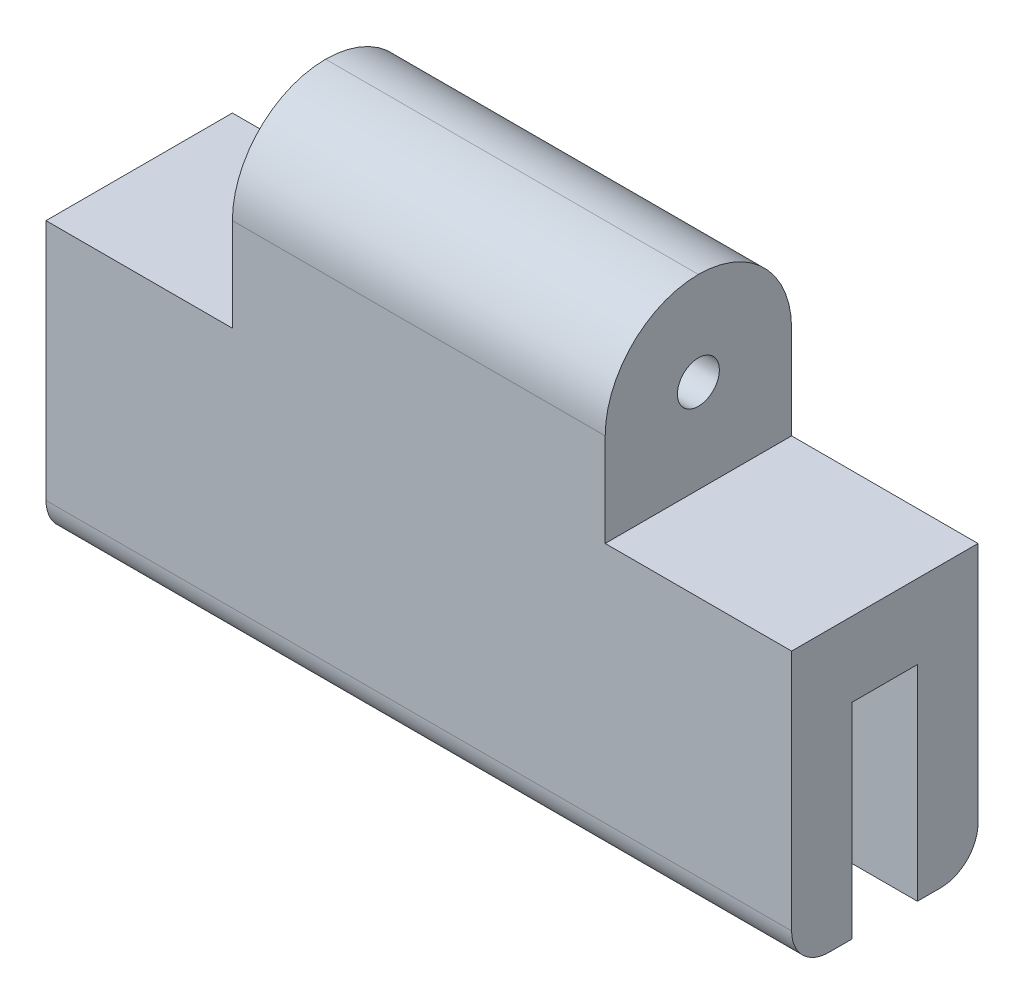
ISO-10303-21;
HEADER;
FILE_DESCRIPTION(('STEP AP214'),'2;1');
FILE_NAME('part.step','',(''),(''),'','','');
FILE_SCHEMA(('AUTOMOTIVE_DESIGN { 1 0 10303 214 1 1 1 1 }'));
ENDSEC;
DATA;
#1=APPLICATION_CONTEXT('core data for automotive mechanical design processes');
#2=APPLICATION_PROTOCOL_DEFINITION('international standard','automotive_design',2000,#1);
#3=PRODUCT_CONTEXT('',#1,'mechanical');
#4=PRODUCT('Part','Part','',(#3));
#5=PRODUCT_RELATED_PRODUCT_CATEGORY('part','',(#4));
#6=PRODUCT_DEFINITION_FORMATION('','',#4);
#7=PRODUCT_DEFINITION_CONTEXT('part definition',#1,'design');
#8=PRODUCT_DEFINITION('design','',#6,#7);
#9=PRODUCT_DEFINITION_SHAPE('','',#8);
#10=(LENGTH_UNIT() NAMED_UNIT(*) SI_UNIT(.MILLI.,.METRE.));
#11=(NAMED_UNIT(*) PLANE_ANGLE_UNIT() SI_UNIT($,.RADIAN.));
#12=(NAMED_UNIT(*) SI_UNIT($,.STERADIAN.) SOLID_ANGLE_UNIT());
#13=UNCERTAINTY_MEASURE_WITH_UNIT(LENGTH_MEASURE(1.E-05),#10,'distance_accuracy_value','');
#14=(GEOMETRIC_REPRESENTATION_CONTEXT(3) GLOBAL_UNCERTAINTY_ASSIGNED_CONTEXT((#13)) GLOBAL_UNIT_ASSIGNED_CONTEXT((#10,
#11,#12)) REPRESENTATION_CONTEXT('',''));
#15=CARTESIAN_POINT('',(0.,0.,0.));
#16=DIRECTION('',(0.,0.,1.));
#17=DIRECTION('',(1.,0.,0.));
#18=AXIS2_PLACEMENT_3D('',#15,#16,#17);
#19=CARTESIAN_POINT('',(0.,30.,0.));
#20=DIRECTION('',(0.,1.,0.));
#21=DIRECTION('',(0.,0.,1.));
#22=AXIS2_PLACEMENT_3D('',#19,#20,#21);
#23=PLANE('',#22);
#24=DIRECTION('',(0.,0.,1.));
#25=VECTOR('',#24,1.);
#26=CARTESIAN_POINT('',(20.,30.,0.));
#27=LINE('',#26,#25);
#28=CARTESIAN_POINT('',(20.,30.,0.));
#29=VERTEX_POINT('',#28);
#30=CARTESIAN_POINT('',(20.,30.,20.));
#31=VERTEX_POINT('',#30);
#32=EDGE_CURVE('E166',#29,#31,#27,.T.);
#33=ORIENTED_EDGE('',*,*,#32,.F.);
#34=DIRECTION('',(-1.,0.,0.));
#35=VECTOR('',#34,1.);
#36=CARTESIAN_POINT('',(0.,30.,0.));
#37=LINE('',#36,#35);
#38=CARTESIAN_POINT('',(0.,30.,0.));
#39=VERTEX_POINT('',#38);
#40=EDGE_CURVE('E162',#29,#39,#37,.T.);
#41=ORIENTED_EDGE('',*,*,#40,.T.);
#42=DIRECTION('',(0.,0.,1.));
#43=VECTOR('',#42,1.);
#44=CARTESIAN_POINT('',(0.,30.,0.));
#45=LINE('',#44,#43);
#46=CARTESIAN_POINT('',(0.,30.,20.));
#47=VERTEX_POINT('',#46);
#48=EDGE_CURVE('E205',#39,#47,#45,.T.);
#49=ORIENTED_EDGE('',*,*,#48,.T.);
#50=DIRECTION('',(1.,0.,0.));
#51=VECTOR('',#50,1.);
#52=CARTESIAN_POINT('',(0.,30.,20.));
#53=LINE('',#52,#51);
#54=EDGE_CURVE('E210',#47,#31,#53,.T.);
#55=ORIENTED_EDGE('',*,*,#54,.T.);
#56=EDGE_LOOP('',(#33,#41,#49,#55));
#57=FACE_BOUND('',#56,.T.);
#58=ADVANCED_FACE('F33',(#57),#23,.T.);
#59=CARTESIAN_POINT('',(0.,0.,0.));
#60=DIRECTION('',(0.,1.,0.));
#61=DIRECTION('',(0.,0.,1.));
#62=AXIS2_PLACEMENT_3D('',#59,#60,#61);
#63=PLANE('',#62);
#64=DIRECTION('',(0.,0.,-1.));
#65=VECTOR('',#64,1.);
#66=CARTESIAN_POINT('',(80.,0.,0.));
#67=LINE('',#66,#65);
#68=CARTESIAN_POINT('',(80.,0.,16.));
#69=VERTEX_POINT('',#68);
#70=CARTESIAN_POINT('',(80.,0.,13.5));
#71=VERTEX_POINT('',#70);
#72=EDGE_CURVE('E209',#69,#71,#67,.T.);
#73=ORIENTED_EDGE('',*,*,#72,.F.);
#74=DIRECTION('',(1.,0.,0.));
#75=VECTOR('',#74,1.);
#76=CARTESIAN_POINT('',(0.,0.,16.));
#77=LINE('',#76,#75);
#78=CARTESIAN_POINT('',(0.,0.,16.));
#79=VERTEX_POINT('',#78);
#80=EDGE_CURVE('E11',#69,#79,#77,.F.);
#81=ORIENTED_EDGE('',*,*,#80,.T.);
#82=DIRECTION('',(0.,0.,1.));
#83=VECTOR('',#82,1.);
#84=CARTESIAN_POINT('',(0.,0.,0.));
#85=LINE('',#84,#83);
#86=CARTESIAN_POINT('',(0.,0.,13.5));
#87=VERTEX_POINT('',#86);
#88=EDGE_CURVE('E196',#87,#79,#85,.T.);
#89=ORIENTED_EDGE('',*,*,#88,.F.);
#90=DIRECTION('',(-1.,0.,0.));
#91=VECTOR('',#90,1.);
#92=CARTESIAN_POINT('',(0.,0.,13.5));
#93=LINE('',#92,#91);
#94=EDGE_CURVE('E182',#71,#87,#93,.T.);
#95=ORIENTED_EDGE('',*,*,#94,.F.);
#96=EDGE_LOOP('',(#73,#81,#89,#95));
#97=FACE_BOUND('',#96,.T.);
#98=ADVANCED_FACE('F291',(#97),#63,.F.);
#99=CARTESIAN_POINT('',(0.,30.,0.));
#100=DIRECTION('',(1.,0.,0.));
#101=DIRECTION('',(0.,0.,-1.));
#102=AXIS2_PLACEMENT_3D('',#99,#100,#101);
#103=PLANE('',#102);
#104=DIRECTION('',(0.,-1.,0.));
#105=VECTOR('',#104,1.);
#106=CARTESIAN_POINT('',(0.,30.,0.));
#107=LINE('',#106,#105);
#108=CARTESIAN_POINT('',(0.,4.,0.));
#109=VERTEX_POINT('',#108);
#110=EDGE_CURVE('E161',#39,#109,#107,.T.);
#111=ORIENTED_EDGE('',*,*,#110,.T.);
#112=CARTESIAN_POINT('',(0.,4.,4.));
#113=DIRECTION('',(1.,0.,0.));
#114=DIRECTION('',(0.,0.,-1.));
#115=AXIS2_PLACEMENT_3D('',#112,#113,#114);
#116=CIRCLE('',#115,4.);
#117=CARTESIAN_POINT('',(0.,0.,4.));
#118=VERTEX_POINT('',#117);
#119=EDGE_CURVE('E249',#109,#118,#116,.F.);
#120=ORIENTED_EDGE('',*,*,#119,.T.);
#121=CARTESIAN_POINT('',(0.,0.,6.5));
#122=VERTEX_POINT('',#121);
#123=EDGE_CURVE('E214',#118,#122,#85,.T.);
#124=ORIENTED_EDGE('',*,*,#123,.T.);
#125=DIRECTION('',(0.,-1.,0.));
#126=VECTOR('',#125,1.);
#127=CARTESIAN_POINT('',(0.,22.,6.49999999999999));
#128=LINE('',#127,#126);
#129=CARTESIAN_POINT('',(0.,22.,6.49999999999999));
#130=VERTEX_POINT('',#129);
#131=EDGE_CURVE('E190',#130,#122,#128,.T.);
#132=ORIENTED_EDGE('',*,*,#131,.F.);
#133=DIRECTION('',(0.,0.,-1.));
#134=VECTOR('',#133,1.);
#135=CARTESIAN_POINT('',(0.,22.,6.49999999999999));
#136=LINE('',#135,#134);
#137=CARTESIAN_POINT('',(0.,22.,13.5));
#138=VERTEX_POINT('',#137);
#139=EDGE_CURVE('E178',#138,#130,#136,.T.);
#140=ORIENTED_EDGE('',*,*,#139,.F.);
#141=DIRECTION('',(0.,-1.,0.));
#142=VECTOR('',#141,1.);
#143=CARTESIAN_POINT('',(0.,22.,13.5));
#144=LINE('',#143,#142);
#145=EDGE_CURVE('E193',#138,#87,#144,.T.);
#146=ORIENTED_EDGE('',*,*,#145,.T.);
#147=ORIENTED_EDGE('',*,*,#88,.T.);
#148=CARTESIAN_POINT('',(0.,4.,16.));
#149=DIRECTION('',(1.,0.,0.));
#150=DIRECTION('',(0.,0.,-1.));
#151=AXIS2_PLACEMENT_3D('',#148,#149,#150);
#152=CIRCLE('',#151,4.);
#153=CARTESIAN_POINT('',(0.,4.,20.));
#154=VERTEX_POINT('',#153);
#155=EDGE_CURVE('E247',#79,#154,#152,.F.);
#156=ORIENTED_EDGE('',*,*,#155,.T.);
#157=DIRECTION('',(0.,-1.,0.));
#158=VECTOR('',#157,1.);
#159=CARTESIAN_POINT('',(0.,30.,20.));
#160=LINE('',#159,#158);
#161=EDGE_CURVE('E224',#47,#154,#160,.T.);
#162=ORIENTED_EDGE('',*,*,#161,.F.);
#163=ORIENTED_EDGE('',*,*,#48,.F.);
#164=EDGE_LOOP('',(#111,#120,#124,#132,#140,#146,#147,#156,#162,#163));
#165=FACE_BOUND('',#164,.T.);
#166=ADVANCED_FACE('F270',(#165),#103,.F.);
#167=CARTESIAN_POINT('',(0.,30.,20.));
#168=DIRECTION('',(0.,0.,-1.));
#169=DIRECTION('',(-1.,0.,0.));
#170=AXIS2_PLACEMENT_3D('',#167,#168,#169);
#171=PLANE('',#170);
#172=ORIENTED_EDGE('',*,*,#161,.T.);
#173=DIRECTION('',(1.,0.,0.));
#174=VECTOR('',#173,1.);
#175=CARTESIAN_POINT('',(0.,4.,20.));
#176=LINE('',#175,#174);
#177=CARTESIAN_POINT('',(80.,4.,20.));
#178=VERTEX_POINT('',#177);
#179=EDGE_CURVE('E41',#154,#178,#176,.T.);
#180=ORIENTED_EDGE('',*,*,#179,.T.);
#181=DIRECTION('',(0.,-1.,0.));
#182=VECTOR('',#181,1.);
#183=CARTESIAN_POINT('',(80.,30.,20.));
#184=LINE('',#183,#182);
#185=CARTESIAN_POINT('',(80.,30.,20.));
#186=VERTEX_POINT('',#185);
#187=EDGE_CURVE('E222',#186,#178,#184,.T.);
#188=ORIENTED_EDGE('',*,*,#187,.F.);
#189=CARTESIAN_POINT('',(60.,30.,20.));
#190=VERTEX_POINT('',#189);
#191=EDGE_CURVE('E208',#190,#186,#53,.T.);
#192=ORIENTED_EDGE('',*,*,#191,.F.);
#193=DIRECTION('',(0.,-1.,0.));
#194=VECTOR('',#193,1.);
#195=CARTESIAN_POINT('',(60.,50.,20.));
#196=LINE('',#195,#194);
#197=CARTESIAN_POINT('',(60.,40.,20.));
#198=VERTEX_POINT('',#197);
#199=EDGE_CURVE('E150',#198,#190,#196,.T.);
#200=ORIENTED_EDGE('',*,*,#199,.F.);
#201=DIRECTION('',(1.,0.,0.));
#202=VECTOR('',#201,1.);
#203=CARTESIAN_POINT('',(20.,40.,20.));
#204=LINE('',#203,#202);
#205=CARTESIAN_POINT('',(20.,40.,20.));
#206=VERTEX_POINT('',#205);
#207=EDGE_CURVE('E239',#198,#206,#204,.F.);
#208=ORIENTED_EDGE('',*,*,#207,.T.);
#209=DIRECTION('',(0.,-1.,0.));
#210=VECTOR('',#209,1.);
#211=CARTESIAN_POINT('',(20.,50.,20.));
#212=LINE('',#211,#210);
#213=EDGE_CURVE('E175',#206,#31,#212,.T.);
#214=ORIENTED_EDGE('',*,*,#213,.T.);
#215=ORIENTED_EDGE('',*,*,#54,.F.);
#216=EDGE_LOOP('',(#172,#180,#188,#192,#200,#208,#214,#215));
#217=FACE_BOUND('',#216,.T.);
#218=ADVANCED_FACE('F257',(#217),#171,.F.);
#219=CARTESIAN_POINT('',(80.,30.,0.));
#220=DIRECTION('',(-1.,0.,0.));
#221=DIRECTION('',(0.,0.,1.));
#222=AXIS2_PLACEMENT_3D('',#219,#220,#221);
#223=PLANE('',#222);
#224=CARTESIAN_POINT('',(80.,0.,6.5));
#225=VERTEX_POINT('',#224);
#226=CARTESIAN_POINT('',(80.,0.,4.));
#227=VERTEX_POINT('',#226);
#228=EDGE_CURVE('E216',#225,#227,#67,.T.);
#229=ORIENTED_EDGE('',*,*,#228,.T.);
#230=CARTESIAN_POINT('',(80.,4.,4.));
#231=DIRECTION('',(-1.,0.,0.));
#232=DIRECTION('',(0.,0.,1.));
#233=AXIS2_PLACEMENT_3D('',#230,#231,#232);
#234=CIRCLE('',#233,4.);
#235=CARTESIAN_POINT('',(80.,4.,0.));
#236=VERTEX_POINT('',#235);
#237=EDGE_CURVE('E254',#227,#236,#234,.F.);
#238=ORIENTED_EDGE('',*,*,#237,.T.);
#239=DIRECTION('',(0.,-1.,0.));
#240=VECTOR('',#239,1.);
#241=CARTESIAN_POINT('',(80.,30.,0.));
#242=LINE('',#241,#240);
#243=CARTESIAN_POINT('',(80.,30.,0.));
#244=VERTEX_POINT('',#243);
#245=EDGE_CURVE('E220',#244,#236,#242,.T.);
#246=ORIENTED_EDGE('',*,*,#245,.F.);
#247=DIRECTION('',(0.,0.,-1.));
#248=VECTOR('',#247,1.);
#249=CARTESIAN_POINT('',(80.,30.,0.));
#250=LINE('',#249,#248);
#251=EDGE_CURVE('E159',#186,#244,#250,.T.);
#252=ORIENTED_EDGE('',*,*,#251,.F.);
#253=ORIENTED_EDGE('',*,*,#187,.T.);
#254=CARTESIAN_POINT('',(80.,4.,16.));
#255=DIRECTION('',(-1.,0.,0.));
#256=DIRECTION('',(0.,0.,1.));
#257=AXIS2_PLACEMENT_3D('',#254,#255,#256);
#258=CIRCLE('',#257,4.);
#259=EDGE_CURVE('E48',#178,#69,#258,.F.);
#260=ORIENTED_EDGE('',*,*,#259,.T.);
#261=ORIENTED_EDGE('',*,*,#72,.T.);
#262=DIRECTION('',(0.,-1.,0.));
#263=VECTOR('',#262,1.);
#264=CARTESIAN_POINT('',(80.,22.,13.5));
#265=LINE('',#264,#263);
#266=CARTESIAN_POINT('',(80.,22.,13.5));
#267=VERTEX_POINT('',#266);
#268=EDGE_CURVE('E197',#267,#71,#265,.T.);
#269=ORIENTED_EDGE('',*,*,#268,.F.);
#270=DIRECTION('',(0.,0.,1.));
#271=VECTOR('',#270,1.);
#272=CARTESIAN_POINT('',(80.,22.,6.5));
#273=LINE('',#272,#271);
#274=CARTESIAN_POINT('',(80.,22.,6.5));
#275=VERTEX_POINT('',#274);
#276=EDGE_CURVE('E185',#275,#267,#273,.T.);
#277=ORIENTED_EDGE('',*,*,#276,.F.);
#278=DIRECTION('',(0.,-1.,0.));
#279=VECTOR('',#278,1.);
#280=CARTESIAN_POINT('',(80.,22.,6.5));
#281=LINE('',#280,#279);
#282=EDGE_CURVE('E200',#275,#225,#281,.T.);
#283=ORIENTED_EDGE('',*,*,#282,.T.);
#284=EDGE_LOOP('',(#229,#238,#246,#252,#253,#260,#261,#269,#277,#283));
#285=FACE_BOUND('',#284,.T.);
#286=ADVANCED_FACE('F261',(#285),#223,.F.);
#287=CARTESIAN_POINT('',(0.,30.,0.));
#288=DIRECTION('',(0.,0.,1.));
#289=DIRECTION('',(1.,0.,0.));
#290=AXIS2_PLACEMENT_3D('',#287,#288,#289);
#291=PLANE('',#290);
#292=ORIENTED_EDGE('',*,*,#245,.T.);
#293=DIRECTION('',(-1.,0.,0.));
#294=VECTOR('',#293,1.);
#295=CARTESIAN_POINT('',(0.,4.,0.));
#296=LINE('',#295,#294);
#297=EDGE_CURVE('E241',#236,#109,#296,.T.);
#298=ORIENTED_EDGE('',*,*,#297,.T.);
#299=ORIENTED_EDGE('',*,*,#110,.F.);
#300=ORIENTED_EDGE('',*,*,#40,.F.);
#301=DIRECTION('',(0.,-1.,0.));
#302=VECTOR('',#301,1.);
#303=CARTESIAN_POINT('',(20.,50.,0.));
#304=LINE('',#303,#302);
#305=CARTESIAN_POINT('',(20.,40.,0.));
#306=VERTEX_POINT('',#305);
#307=EDGE_CURVE('E151',#306,#29,#304,.T.);
#308=ORIENTED_EDGE('',*,*,#307,.F.);
#309=DIRECTION('',(-1.,0.,0.));
#310=VECTOR('',#309,1.);
#311=CARTESIAN_POINT('',(60.,40.,0.));
#312=LINE('',#311,#310);
#313=CARTESIAN_POINT('',(60.,40.,0.));
#314=VERTEX_POINT('',#313);
#315=EDGE_CURVE('E147',#306,#314,#312,.F.);
#316=ORIENTED_EDGE('',*,*,#315,.T.);
#317=DIRECTION('',(0.,-1.,0.));
#318=VECTOR('',#317,1.);
#319=CARTESIAN_POINT('',(60.,50.,0.));
#320=LINE('',#319,#318);
#321=CARTESIAN_POINT('',(60.,30.,0.));
#322=VERTEX_POINT('',#321);
#323=EDGE_CURVE('E140',#314,#322,#320,.T.);
#324=ORIENTED_EDGE('',*,*,#323,.T.);
#325=EDGE_CURVE('E144',#244,#322,#37,.T.);
#326=ORIENTED_EDGE('',*,*,#325,.F.);
#327=EDGE_LOOP('',(#292,#298,#299,#300,#308,#316,#324,#326));
#328=FACE_BOUND('',#327,.T.);
#329=ADVANCED_FACE('F143',(#328),#291,.F.);
#330=DIRECTION('',(0.,0.,-1.));
#331=VECTOR('',#330,1.);
#332=CARTESIAN_POINT('',(60.,30.,0.));
#333=LINE('',#332,#331);
#334=EDGE_CURVE('E156',#190,#322,#333,.T.);
#335=ORIENTED_EDGE('',*,*,#334,.F.);
#336=ORIENTED_EDGE('',*,*,#191,.T.);
#337=ORIENTED_EDGE('',*,*,#251,.T.);
#338=ORIENTED_EDGE('',*,*,#325,.T.);
#339=EDGE_LOOP('',(#335,#336,#337,#338));
#340=FACE_BOUND('',#339,.T.);
#341=ADVANCED_FACE('F155',(#340),#23,.T.);
#342=ORIENTED_EDGE('',*,*,#123,.F.);
#343=DIRECTION('',(-1.,0.,0.));
#344=VECTOR('',#343,1.);
#345=CARTESIAN_POINT('',(0.,0.,4.));
#346=LINE('',#345,#344);
#347=EDGE_CURVE('E251',#118,#227,#346,.F.);
#348=ORIENTED_EDGE('',*,*,#347,.T.);
#349=ORIENTED_EDGE('',*,*,#228,.F.);
#350=DIRECTION('',(1.,0.,0.));
#351=VECTOR('',#350,1.);
#352=CARTESIAN_POINT('',(0.,0.,6.49999999999999));
#353=LINE('',#352,#351);
#354=EDGE_CURVE('E177',#122,#225,#353,.T.);
#355=ORIENTED_EDGE('',*,*,#354,.F.);
#356=EDGE_LOOP('',(#342,#348,#349,#355));
#357=FACE_BOUND('',#356,.T.);
#358=ADVANCED_FACE('F275',(#357),#63,.F.);
#359=CARTESIAN_POINT('',(0.,22.,13.5));
#360=DIRECTION('',(0.,0.,1.));
#361=DIRECTION('',(1.,0.,0.));
#362=AXIS2_PLACEMENT_3D('',#359,#360,#361);
#363=PLANE('',#362);
#364=ORIENTED_EDGE('',*,*,#94,.T.);
#365=ORIENTED_EDGE('',*,*,#145,.F.);
#366=DIRECTION('',(-1.,0.,0.));
#367=VECTOR('',#366,1.);
#368=CARTESIAN_POINT('',(0.,22.,13.5));
#369=LINE('',#368,#367);
#370=EDGE_CURVE('E187',#267,#138,#369,.T.);
#371=ORIENTED_EDGE('',*,*,#370,.F.);
#372=ORIENTED_EDGE('',*,*,#268,.T.);
#373=EDGE_LOOP('',(#364,#365,#371,#372));
#374=FACE_BOUND('',#373,.T.);
#375=ADVANCED_FACE('F286',(#374),#363,.F.);
#376=CARTESIAN_POINT('',(0.,22.,6.49999999999999));
#377=DIRECTION('',(0.,0.,-1.));
#378=DIRECTION('',(-1.,0.,0.));
#379=AXIS2_PLACEMENT_3D('',#376,#377,#378);
#380=PLANE('',#379);
#381=ORIENTED_EDGE('',*,*,#354,.T.);
#382=ORIENTED_EDGE('',*,*,#282,.F.);
#383=DIRECTION('',(1.,0.,0.));
#384=VECTOR('',#383,1.);
#385=CARTESIAN_POINT('',(0.,22.,6.49999999999999));
#386=LINE('',#385,#384);
#387=EDGE_CURVE('E181',#130,#275,#386,.T.);
#388=ORIENTED_EDGE('',*,*,#387,.F.);
#389=ORIENTED_EDGE('',*,*,#131,.T.);
#390=EDGE_LOOP('',(#381,#382,#388,#389));
#391=FACE_BOUND('',#390,.T.);
#392=ADVANCED_FACE('F278',(#391),#380,.F.);
#393=CARTESIAN_POINT('',(0.,22.,0.));
#394=DIRECTION('',(0.,1.,0.));
#395=DIRECTION('',(0.,0.,1.));
#396=AXIS2_PLACEMENT_3D('',#393,#394,#395);
#397=PLANE('',#396);
#398=ORIENTED_EDGE('',*,*,#139,.T.);
#399=ORIENTED_EDGE('',*,*,#387,.T.);
#400=ORIENTED_EDGE('',*,*,#276,.T.);
#401=ORIENTED_EDGE('',*,*,#370,.T.);
#402=EDGE_LOOP('',(#398,#399,#400,#401));
#403=FACE_BOUND('',#402,.T.);
#404=ADVANCED_FACE('F283',(#403),#397,.F.);
#405=CARTESIAN_POINT('',(20.,50.,0.));
#406=DIRECTION('',(1.,0.,0.));
#407=DIRECTION('',(0.,0.,-1.));
#408=AXIS2_PLACEMENT_3D('',#405,#406,#407);
#409=PLANE('',#408);
#410=CARTESIAN_POINT('',(20.,40.,10.));
#411=DIRECTION('',(-1.,0.,0.));
#412=DIRECTION('',(0.,0.,1.));
#413=AXIS2_PLACEMENT_3D('',#410,#411,#412);
#414=CIRCLE('',#413,2.25);
#415=CARTESIAN_POINT('',(20.,40.,12.25));
#416=VERTEX_POINT('',#415);
#417=EDGE_CURVE('E230',#416,#416,#414,.T.);
#418=ORIENTED_EDGE('',*,*,#417,.F.);
#419=EDGE_LOOP('',(#418));
#420=FACE_BOUND('',#419,.T.);
#421=CARTESIAN_POINT('',(20.,40.,10.));
#422=DIRECTION('',(1.,0.,0.));
#423=DIRECTION('',(0.,0.,-1.));
#424=AXIS2_PLACEMENT_3D('',#421,#422,#423);
#425=CIRCLE('',#424,10.);
#426=CARTESIAN_POINT('',(20.,50.,10.));
#427=VERTEX_POINT('',#426);
#428=EDGE_CURVE('E227',#206,#427,#425,.F.);
#429=ORIENTED_EDGE('',*,*,#428,.T.);
#430=CARTESIAN_POINT('',(20.,40.,10.));
#431=DIRECTION('',(1.,0.,0.));
#432=DIRECTION('',(0.,0.,-1.));
#433=AXIS2_PLACEMENT_3D('',#430,#431,#432);
#434=CIRCLE('',#433,10.);
#435=EDGE_CURVE('E232',#427,#306,#434,.F.);
#436=ORIENTED_EDGE('',*,*,#435,.T.);
#437=ORIENTED_EDGE('',*,*,#307,.T.);
#438=ORIENTED_EDGE('',*,*,#32,.T.);
#439=ORIENTED_EDGE('',*,*,#213,.F.);
#440=EDGE_LOOP('',(#429,#436,#437,#438,#439));
#441=FACE_BOUND('',#440,.T.);
#442=ADVANCED_FACE('F306',(#420,#441),#409,.F.);
#443=CARTESIAN_POINT('',(60.,50.,0.));
#444=DIRECTION('',(-1.,0.,0.));
#445=DIRECTION('',(0.,0.,1.));
#446=AXIS2_PLACEMENT_3D('',#443,#444,#445);
#447=PLANE('',#446);
#448=CARTESIAN_POINT('',(60.,40.,9.99999999999999));
#449=DIRECTION('',(-1.,0.,0.));
#450=DIRECTION('',(0.,0.,1.));
#451=AXIS2_PLACEMENT_3D('',#448,#449,#450);
#452=CIRCLE('',#451,2.25);
#453=CARTESIAN_POINT('',(60.,40.,12.25));
#454=VERTEX_POINT('',#453);
#455=EDGE_CURVE('E170',#454,#454,#452,.T.);
#456=ORIENTED_EDGE('',*,*,#455,.T.);
#457=EDGE_LOOP('',(#456));
#458=FACE_BOUND('',#457,.T.);
#459=ORIENTED_EDGE('',*,*,#323,.F.);
#460=CARTESIAN_POINT('',(60.,40.,10.));
#461=DIRECTION('',(-1.,0.,0.));
#462=DIRECTION('',(0.,0.,1.));
#463=AXIS2_PLACEMENT_3D('',#460,#461,#462);
#464=CIRCLE('',#463,10.);
#465=CARTESIAN_POINT('',(60.,50.,10.));
#466=VERTEX_POINT('',#465);
#467=EDGE_CURVE('E237',#314,#466,#464,.F.);
#468=ORIENTED_EDGE('',*,*,#467,.T.);
#469=CARTESIAN_POINT('',(60.,40.,10.));
#470=DIRECTION('',(-1.,0.,0.));
#471=DIRECTION('',(0.,0.,1.));
#472=AXIS2_PLACEMENT_3D('',#469,#470,#471);
#473=CIRCLE('',#472,10.);
#474=EDGE_CURVE('E235',#466,#198,#473,.F.);
#475=ORIENTED_EDGE('',*,*,#474,.T.);
#476=ORIENTED_EDGE('',*,*,#199,.T.);
#477=ORIENTED_EDGE('',*,*,#334,.T.);
#478=EDGE_LOOP('',(#459,#468,#475,#476,#477));
#479=FACE_BOUND('',#478,.T.);
#480=ADVANCED_FACE('F164',(#458,#479),#447,.F.);
#481=CARTESIAN_POINT('',(80.,40.,9.99999999999999));
#482=DIRECTION('',(-1.,0.,0.));
#483=DIRECTION('',(0.,0.,1.));
#484=AXIS2_PLACEMENT_3D('',#481,#482,#483);
#485=CYLINDRICAL_SURFACE('',#484,2.25);
#486=ORIENTED_EDGE('',*,*,#417,.T.);
#487=EDGE_LOOP('',(#486));
#488=FACE_BOUND('',#487,.T.);
#489=ORIENTED_EDGE('',*,*,#455,.F.);
#490=EDGE_LOOP('',(#489));
#491=FACE_BOUND('',#490,.T.);
#492=ADVANCED_FACE('F314',(#488,#491),#485,.F.);
#493=CARTESIAN_POINT('',(0.,40.,10.));
#494=DIRECTION('',(-1.,0.,0.));
#495=DIRECTION('',(0.,0.,1.));
#496=AXIS2_PLACEMENT_3D('',#493,#494,#495);
#497=CYLINDRICAL_SURFACE('',#496,10.);
#498=ORIENTED_EDGE('',*,*,#207,.F.);
#499=ORIENTED_EDGE('',*,*,#474,.F.);
#500=DIRECTION('',(1.,0.,0.));
#501=VECTOR('',#500,1.);
#502=CARTESIAN_POINT('',(60.,50.,10.));
#503=LINE('',#502,#501);
#504=EDGE_CURVE('E242',#427,#466,#503,.T.);
#505=ORIENTED_EDGE('',*,*,#504,.F.);
#506=ORIENTED_EDGE('',*,*,#428,.F.);
#507=EDGE_LOOP('',(#498,#499,#505,#506));
#508=FACE_BOUND('',#507,.T.);
#509=ADVANCED_FACE('F303',(#508),#497,.T.);
#510=CARTESIAN_POINT('',(0.,40.,10.));
#511=DIRECTION('',(1.,0.,0.));
#512=DIRECTION('',(0.,0.,-1.));
#513=AXIS2_PLACEMENT_3D('',#510,#511,#512);
#514=CYLINDRICAL_SURFACE('',#513,10.);
#515=ORIENTED_EDGE('',*,*,#467,.F.);
#516=ORIENTED_EDGE('',*,*,#315,.F.);
#517=ORIENTED_EDGE('',*,*,#435,.F.);
#518=ORIENTED_EDGE('',*,*,#504,.T.);
#519=EDGE_LOOP('',(#515,#516,#517,#518));
#520=FACE_BOUND('',#519,.T.);
#521=ADVANCED_FACE('F298',(#520),#514,.T.);
#522=CARTESIAN_POINT('',(0.,4.,4.));
#523=DIRECTION('',(-1.,0.,0.));
#524=DIRECTION('',(0.,0.,1.));
#525=AXIS2_PLACEMENT_3D('',#522,#523,#524);
#526=CYLINDRICAL_SURFACE('',#525,4.);
#527=ORIENTED_EDGE('',*,*,#237,.F.);
#528=ORIENTED_EDGE('',*,*,#347,.F.);
#529=ORIENTED_EDGE('',*,*,#119,.F.);
#530=ORIENTED_EDGE('',*,*,#297,.F.);
#531=EDGE_LOOP('',(#527,#528,#529,#530));
#532=FACE_BOUND('',#531,.T.);
#533=ADVANCED_FACE('F266',(#532),#526,.T.);
#534=CARTESIAN_POINT('',(0.,4.,16.));
#535=DIRECTION('',(1.,0.,0.));
#536=DIRECTION('',(0.,0.,-1.));
#537=AXIS2_PLACEMENT_3D('',#534,#535,#536);
#538=CYLINDRICAL_SURFACE('',#537,4.);
#539=ORIENTED_EDGE('',*,*,#155,.F.);
#540=ORIENTED_EDGE('',*,*,#80,.F.);
#541=ORIENTED_EDGE('',*,*,#259,.F.);
#542=ORIENTED_EDGE('',*,*,#179,.F.);
#543=EDGE_LOOP('',(#539,#540,#541,#542));
#544=FACE_BOUND('',#543,.T.);
#545=ADVANCED_FACE('F35',(#544),#538,.T.);
#546=CLOSED_SHELL('',(#58,#98,#166,#218,#286,#329,#341,#358,#375,#392,#404,#442,#480,#492,#509,
#521,#533,#545));
#547=MANIFOLD_SOLID_BREP('B2',#546);
#548=ADVANCED_BREP_SHAPE_REPRESENTATION('',(#18,#547),#14);
#549=SHAPE_DEFINITION_REPRESENTATION(#9,#548);
ENDSEC;
END-ISO-10303-21;
